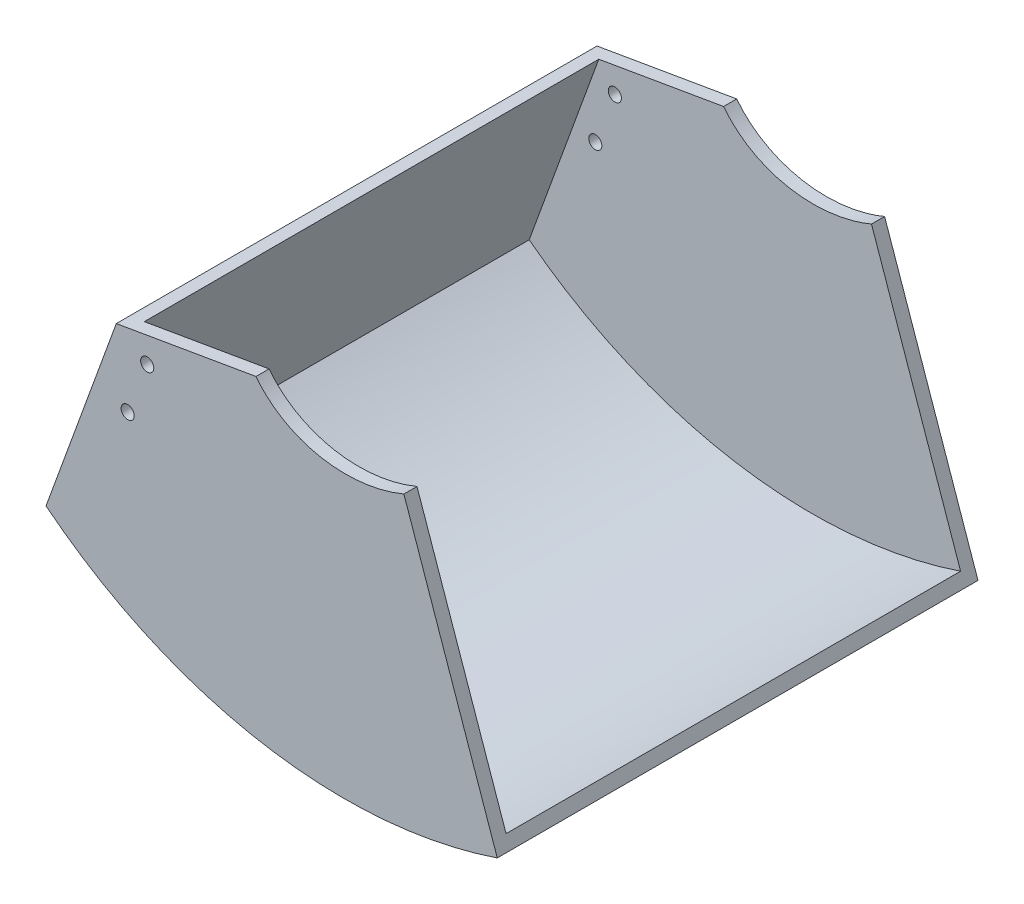
ISO-10303-21;
HEADER;
FILE_DESCRIPTION(('STEP AP214'),'2;1');
FILE_NAME('part.step','',(''),(''),'','','');
FILE_SCHEMA(('AUTOMOTIVE_DESIGN { 1 0 10303 214 1 1 1 1 }'));
ENDSEC;
DATA;
#1=APPLICATION_CONTEXT('core data for automotive mechanical design processes');
#2=APPLICATION_PROTOCOL_DEFINITION('international standard','automotive_design',2000,#1);
#3=PRODUCT_CONTEXT('',#1,'mechanical');
#4=PRODUCT('Part','Part','',(#3));
#5=PRODUCT_RELATED_PRODUCT_CATEGORY('part','',(#4));
#6=PRODUCT_DEFINITION_FORMATION('','',#4);
#7=PRODUCT_DEFINITION_CONTEXT('part definition',#1,'design');
#8=PRODUCT_DEFINITION('design','',#6,#7);
#9=PRODUCT_DEFINITION_SHAPE('','',#8);
#10=(LENGTH_UNIT() NAMED_UNIT(*) SI_UNIT(.MILLI.,.METRE.));
#11=(NAMED_UNIT(*) PLANE_ANGLE_UNIT() SI_UNIT($,.RADIAN.));
#12=(NAMED_UNIT(*) SI_UNIT($,.STERADIAN.) SOLID_ANGLE_UNIT());
#13=UNCERTAINTY_MEASURE_WITH_UNIT(LENGTH_MEASURE(1.E-05),#10,'distance_accuracy_value','');
#14=(GEOMETRIC_REPRESENTATION_CONTEXT(3) GLOBAL_UNCERTAINTY_ASSIGNED_CONTEXT((#13)) GLOBAL_UNIT_ASSIGNED_CONTEXT((#10,
#11,#12)) REPRESENTATION_CONTEXT('',''));
#15=CARTESIAN_POINT('',(0.,0.,0.));
#16=DIRECTION('',(0.,0.,1.));
#17=DIRECTION('',(1.,0.,0.));
#18=AXIS2_PLACEMENT_3D('',#15,#16,#17);
#19=CARTESIAN_POINT('',(72.3340435630929,64.9068914246385,107.));
#20=DIRECTION('',(0.,0.,1.));
#21=DIRECTION('',(1.,0.,0.));
#22=AXIS2_PLACEMENT_3D('',#19,#20,#21);
#23=PLANE('',#22);
#24=CARTESIAN_POINT('',(18.6882589093407,27.9551341610312,107.));
#25=DIRECTION('',(0.,0.,-1.));
#26=DIRECTION('',(-1.,0.,0.));
#27=AXIS2_PLACEMENT_3D('',#24,#25,#26);
#28=CIRCLE('',#27,1.49999999999999);
#29=CARTESIAN_POINT('',(17.1882589093407,27.9551341610312,107.));
#30=VERTEX_POINT('',#29);
#31=EDGE_CURVE('E264',#30,#30,#28,.T.);
#32=ORIENTED_EDGE('',*,*,#31,.F.);
#33=EDGE_LOOP('',(#32));
#34=FACE_BOUND('',#33,.T.);
#35=CARTESIAN_POINT('',(23.1583286059088,39.6285431279022,107.));
#36=DIRECTION('',(0.,0.,-1.));
#37=DIRECTION('',(-1.,0.,0.));
#38=AXIS2_PLACEMENT_3D('',#35,#36,#37);
#39=CIRCLE('',#38,1.49999999999999);
#40=CARTESIAN_POINT('',(21.6583286059088,39.6285431279022,107.));
#41=VERTEX_POINT('',#40);
#42=EDGE_CURVE('E214',#41,#41,#39,.T.);
#43=ORIENTED_EDGE('',*,*,#42,.F.);
#44=EDGE_LOOP('',(#43));
#45=FACE_BOUND('',#44,.T.);
#46=CARTESIAN_POINT('',(68.2395505972083,85.5518618863192,107.));
#47=DIRECTION('',(0.,0.,1.));
#48=DIRECTION('',(-1.,0.,0.));
#49=AXIS2_PLACEMENT_3D('',#46,#47,#48);
#50=CIRCLE('',#49,106.433803451789);
#51=CARTESIAN_POINT('',(3.56451728503891,1.02201755141087,107.));
#52=VERTEX_POINT('',#51);
#53=CARTESIAN_POINT('',(102.274839972419,-15.2933343024916,107.));
#54=VERTEX_POINT('',#53);
#55=EDGE_CURVE('E137',#52,#54,#50,.T.);
#56=ORIENTED_EDGE('',*,*,#55,.F.);
#57=DIRECTION('',(-0.342020143325663,-0.93969262078591,0.));
#58=VECTOR('',#57,1.);
#59=CARTESIAN_POINT('',(3.56451728503891,1.02201755141087,107.));
#60=LINE('',#59,#58);
#61=CARTESIAN_POINT('',(19.4893686582851,44.7751871075765,107.));
#62=VERTEX_POINT('',#61);
#63=EDGE_CURVE('E63',#62,#52,#60,.T.);
#64=ORIENTED_EDGE('',*,*,#63,.F.);
#65=DIRECTION('',(-0.985528105043327,-0.169512106262974,0.));
#66=VECTOR('',#65,1.);
#67=CARTESIAN_POINT('',(48.0436584883286,49.6865618184188,107.));
#68=LINE('',#67,#66);
#69=CARTESIAN_POINT('',(48.0436584883286,49.6865618184188,107.));
#70=VERTEX_POINT('',#69);
#71=EDGE_CURVE('E169',#70,#62,#68,.T.);
#72=ORIENTED_EDGE('',*,*,#71,.F.);
#73=CARTESIAN_POINT('',(72.3340435630929,64.9068914246385,107.));
#74=DIRECTION('',(0.,0.,-1.));
#75=DIRECTION('',(0.93734212712004,0.348410299397246,0.));
#76=AXIS2_PLACEMENT_3D('',#73,#74,#75);
#77=ELLIPSE('',#76,28.9606322735671,23.6005498865162);
#78=CARTESIAN_POINT('',(81.8904704722115,43.3117280106042,107.));
#79=VERTEX_POINT('',#78);
#80=EDGE_CURVE('E165',#79,#70,#77,.T.);
#81=ORIENTED_EDGE('',*,*,#80,.F.);
#82=DIRECTION('',(-0.328520624941273,0.944496796706159,0.));
#83=VECTOR('',#82,1.);
#84=CARTESIAN_POINT('',(103.260442773601,-18.1269423558897,107.));
#85=LINE('',#84,#83);
#86=EDGE_CURVE('E172',#54,#79,#85,.T.);
#87=ORIENTED_EDGE('',*,*,#86,.F.);
#88=EDGE_LOOP('',(#56,#64,#72,#81,#87));
#89=FACE_BOUND('',#88,.T.);
#90=ADVANCED_FACE('F37',(#34,#45,#89),#23,.F.);
#91=DIRECTION('',(0.,0.,1.));
#92=VECTOR('',#91,1.);
#93=SURFACE_OF_LINEAR_EXTRUSION('',#77,#92);
#94=CARTESIAN_POINT('',(72.3340435630929,64.9068914246385,110.));
#95=DIRECTION('',(0.,0.,-1.));
#96=DIRECTION('',(0.93734212712004,0.348410299397246,0.));
#97=AXIS2_PLACEMENT_3D('',#94,#95,#96);
#98=ELLIPSE('',#97,28.9606322735671,23.6005498865162);
#99=CARTESIAN_POINT('',(81.8904704722115,43.3117280106042,110.));
#100=VERTEX_POINT('',#99);
#101=CARTESIAN_POINT('',(48.0436584883286,49.6865618184188,110.));
#102=VERTEX_POINT('',#101);
#103=EDGE_CURVE('E164',#100,#102,#98,.T.);
#104=ORIENTED_EDGE('',*,*,#103,.F.);
#105=DIRECTION('',(0.,0.,1.));
#106=VECTOR('',#105,1.);
#107=CARTESIAN_POINT('',(81.8904704722115,43.3117280106042,107.));
#108=LINE('',#107,#106);
#109=EDGE_CURVE('E11',#79,#100,#108,.T.);
#110=ORIENTED_EDGE('',*,*,#109,.F.);
#111=ORIENTED_EDGE('',*,*,#80,.T.);
#112=DIRECTION('',(0.,0.,1.));
#113=VECTOR('',#112,1.);
#114=CARTESIAN_POINT('',(48.0436584883286,49.6865618184188,107.));
#115=LINE('',#114,#113);
#116=EDGE_CURVE('E42',#70,#102,#115,.T.);
#117=ORIENTED_EDGE('',*,*,#116,.T.);
#118=EDGE_LOOP('',(#104,#110,#111,#117));
#119=FACE_BOUND('',#118,.T.);
#120=ADVANCED_FACE('F39',(#119),#93,.T.);
#121=CARTESIAN_POINT('',(103.260442773601,-18.1269423558897,107.));
#122=DIRECTION('',(0.944496796706159,0.328520624941273,0.));
#123=DIRECTION('',(-0.328520624941273,0.944496796706159,0.));
#124=AXIS2_PLACEMENT_3D('',#121,#122,#123);
#125=PLANE('',#124);
#126=DIRECTION('',(0.,0.,1.));
#127=VECTOR('',#126,1.);
#128=CARTESIAN_POINT('',(81.8904704722115,43.3117280106041,0.));
#129=LINE('',#128,#127);
#130=CARTESIAN_POINT('',(81.8904704722115,43.3117280106041,0.));
#131=VERTEX_POINT('',#130);
#132=CARTESIAN_POINT('',(81.8904704722115,43.3117280106041,3.00000000000002));
#133=VERTEX_POINT('',#132);
#134=EDGE_CURVE('E118',#131,#133,#129,.T.);
#135=ORIENTED_EDGE('',*,*,#134,.T.);
#136=DIRECTION('',(0.328520624941272,-0.944496796706159,0.));
#137=VECTOR('',#136,1.);
#138=CARTESIAN_POINT('',(103.260442773601,-18.1269423558897,3.00000000000002));
#139=LINE('',#138,#137);
#140=CARTESIAN_POINT('',(102.274839972419,-15.2933343024916,3.00000000000002));
#141=VERTEX_POINT('',#140);
#142=EDGE_CURVE('E145',#133,#141,#139,.T.);
#143=ORIENTED_EDGE('',*,*,#142,.T.);
#144=DIRECTION('',(0.,0.,1.));
#145=VECTOR('',#144,1.);
#146=CARTESIAN_POINT('',(102.274839972419,-15.2933343024916,3.00000000000002));
#147=LINE('',#146,#145);
#148=EDGE_CURVE('E162',#141,#54,#147,.T.);
#149=ORIENTED_EDGE('',*,*,#148,.T.);
#150=ORIENTED_EDGE('',*,*,#86,.T.);
#151=ORIENTED_EDGE('',*,*,#109,.T.);
#152=DIRECTION('',(-0.328520624941273,0.944496796706159,0.));
#153=VECTOR('',#152,1.);
#154=CARTESIAN_POINT('',(103.260442773601,-18.1269423558897,110.));
#155=LINE('',#154,#153);
#156=CARTESIAN_POINT('',(103.260442773601,-18.1269423558897,110.));
#157=VERTEX_POINT('',#156);
#158=EDGE_CURVE('E170',#157,#100,#155,.T.);
#159=ORIENTED_EDGE('',*,*,#158,.F.);
#160=DIRECTION('',(0.,0.,1.));
#161=VECTOR('',#160,1.);
#162=CARTESIAN_POINT('',(103.260442773601,-18.1269423558897,107.));
#163=LINE('',#162,#161);
#164=CARTESIAN_POINT('',(103.260442773601,-18.1269423558897,0.));
#165=VERTEX_POINT('',#164);
#166=EDGE_CURVE('E47',#165,#157,#163,.T.);
#167=ORIENTED_EDGE('',*,*,#166,.F.);
#168=DIRECTION('',(0.328520624941272,-0.944496796706159,0.));
#169=VECTOR('',#168,1.);
#170=CARTESIAN_POINT('',(103.260442773601,-18.1269423558897,0.));
#171=LINE('',#170,#169);
#172=EDGE_CURVE('E148',#131,#165,#171,.T.);
#173=ORIENTED_EDGE('',*,*,#172,.F.);
#174=EDGE_LOOP('',(#135,#143,#149,#150,#151,#159,#167,#173));
#175=FACE_BOUND('',#174,.T.);
#176=ADVANCED_FACE('F202',(#175),#125,.T.);
#177=CARTESIAN_POINT('',(68.2395505972083,85.5518618863192,107.));
#178=DIRECTION('',(0.,0.,1.));
#179=DIRECTION('',(1.,0.,0.));
#180=AXIS2_PLACEMENT_3D('',#177,#178,#179);
#181=CYLINDRICAL_SURFACE('',#180,109.433803451789);
#182=CARTESIAN_POINT('',(68.2395505972083,85.5518618863192,110.));
#183=DIRECTION('',(0.,0.,1.));
#184=DIRECTION('',(1.,0.,0.));
#185=AXIS2_PLACEMENT_3D('',#182,#183,#184);
#186=CIRCLE('',#185,109.433803451789);
#187=CARTESIAN_POINT('',(0.,0.,110.));
#188=VERTEX_POINT('',#187);
#189=EDGE_CURVE('E182',#188,#157,#186,.T.);
#190=ORIENTED_EDGE('',*,*,#189,.F.);
#191=DIRECTION('',(0.,0.,1.));
#192=VECTOR('',#191,1.);
#193=CARTESIAN_POINT('',(0.,0.,107.));
#194=LINE('',#193,#192);
#195=CARTESIAN_POINT('',(0.,0.,0.));
#196=VERTEX_POINT('',#195);
#197=EDGE_CURVE('E188',#196,#188,#194,.T.);
#198=ORIENTED_EDGE('',*,*,#197,.F.);
#199=CARTESIAN_POINT('',(68.2395505972083,85.5518618863192,0.));
#200=DIRECTION('',(0.,0.,-1.));
#201=DIRECTION('',(1.,0.,0.));
#202=AXIS2_PLACEMENT_3D('',#199,#200,#201);
#203=CIRCLE('',#202,109.433803451789);
#204=EDGE_CURVE('E141',#165,#196,#203,.T.);
#205=ORIENTED_EDGE('',*,*,#204,.F.);
#206=ORIENTED_EDGE('',*,*,#166,.T.);
#207=EDGE_LOOP('',(#190,#198,#205,#206));
#208=FACE_BOUND('',#207,.T.);
#209=ADVANCED_FACE('F222',(#208),#181,.T.);
#210=CARTESIAN_POINT('',(16.0836243366193,44.1893946878531,107.));
#211=DIRECTION('',(-0.93969262078591,0.342020143325663,0.));
#212=DIRECTION('',(-0.342020143325663,-0.939692620785911,0.));
#213=AXIS2_PLACEMENT_3D('',#210,#211,#212);
#214=PLANE('',#213);
#215=DIRECTION('',(-0.342020143325663,-0.939692620785911,0.));
#216=VECTOR('',#215,1.);
#217=CARTESIAN_POINT('',(16.0836243366193,44.1893946878531,110.));
#218=LINE('',#217,#216);
#219=CARTESIAN_POINT('',(16.0836243366193,44.1893946878531,110.));
#220=VERTEX_POINT('',#219);
#221=EDGE_CURVE('E179',#220,#188,#218,.T.);
#222=ORIENTED_EDGE('',*,*,#221,.F.);
#223=DIRECTION('',(0.,0.,1.));
#224=VECTOR('',#223,1.);
#225=CARTESIAN_POINT('',(16.0836243366193,44.1893946878531,107.));
#226=LINE('',#225,#224);
#227=CARTESIAN_POINT('',(16.0836243366193,44.1893946878531,0.));
#228=VERTEX_POINT('',#227);
#229=EDGE_CURVE('E189',#228,#220,#226,.T.);
#230=ORIENTED_EDGE('',*,*,#229,.F.);
#231=DIRECTION('',(0.342020143325663,0.939692620785911,0.));
#232=VECTOR('',#231,1.);
#233=CARTESIAN_POINT('',(16.0836243366193,44.1893946878531,0.));
#234=LINE('',#233,#232);
#235=EDGE_CURVE('E136',#196,#228,#234,.T.);
#236=ORIENTED_EDGE('',*,*,#235,.F.);
#237=ORIENTED_EDGE('',*,*,#197,.T.);
#238=EDGE_LOOP('',(#222,#230,#236,#237));
#239=FACE_BOUND('',#238,.T.);
#240=ADVANCED_FACE('F221',(#239),#214,.T.);
#241=CARTESIAN_POINT('',(48.0436584883286,49.6865618184188,107.));
#242=DIRECTION('',(-0.169512106262974,0.985528105043327,0.));
#243=DIRECTION('',(-0.985528105043327,-0.169512106262974,0.));
#244=AXIS2_PLACEMENT_3D('',#241,#242,#243);
#245=PLANE('',#244);
#246=DIRECTION('',(0.,0.,1.));
#247=VECTOR('',#246,1.);
#248=CARTESIAN_POINT('',(48.0436584883286,49.6865618184188,0.));
#249=LINE('',#248,#247);
#250=CARTESIAN_POINT('',(48.0436584883286,49.6865618184188,0.));
#251=VERTEX_POINT('',#250);
#252=CARTESIAN_POINT('',(48.0436584883286,49.6865618184188,3.00000000000002));
#253=VERTEX_POINT('',#252);
#254=EDGE_CURVE('E55',#251,#253,#249,.T.);
#255=ORIENTED_EDGE('',*,*,#254,.F.);
#256=DIRECTION('',(0.985528105043327,0.169512106262974,0.));
#257=VECTOR('',#256,1.);
#258=CARTESIAN_POINT('',(77.8876729684396,54.8197708339485,0.));
#259=LINE('',#258,#257);
#260=EDGE_CURVE('E128',#228,#251,#259,.T.);
#261=ORIENTED_EDGE('',*,*,#260,.F.);
#262=ORIENTED_EDGE('',*,*,#229,.T.);
#263=DIRECTION('',(-0.985528105043327,-0.169512106262974,0.));
#264=VECTOR('',#263,1.);
#265=CARTESIAN_POINT('',(48.0436584883286,49.6865618184188,110.));
#266=LINE('',#265,#264);
#267=EDGE_CURVE('E176',#102,#220,#266,.T.);
#268=ORIENTED_EDGE('',*,*,#267,.F.);
#269=ORIENTED_EDGE('',*,*,#116,.F.);
#270=ORIENTED_EDGE('',*,*,#71,.T.);
#271=DIRECTION('',(0.,0.,1.));
#272=VECTOR('',#271,1.);
#273=CARTESIAN_POINT('',(19.4893686582851,44.7751871075765,3.00000000000002));
#274=LINE('',#273,#272);
#275=CARTESIAN_POINT('',(19.4893686582851,44.7751871075765,3.00000000000002));
#276=VERTEX_POINT('',#275);
#277=EDGE_CURVE('E159',#276,#62,#274,.T.);
#278=ORIENTED_EDGE('',*,*,#277,.F.);
#279=DIRECTION('',(0.985528105043327,0.169512106262974,0.));
#280=VECTOR('',#279,1.);
#281=CARTESIAN_POINT('',(77.8876729684396,54.8197708339485,3.00000000000002));
#282=LINE('',#281,#280);
#283=EDGE_CURVE('E130',#276,#253,#282,.T.);
#284=ORIENTED_EDGE('',*,*,#283,.T.);
#285=EDGE_LOOP('',(#255,#261,#262,#268,#269,#270,#278,#284));
#286=FACE_BOUND('',#285,.T.);
#287=ADVANCED_FACE('F127',(#286),#245,.T.);
#288=CARTESIAN_POINT('',(72.3340435630929,64.9068914246385,110.));
#289=DIRECTION('',(0.,0.,1.));
#290=DIRECTION('',(1.,0.,0.));
#291=AXIS2_PLACEMENT_3D('',#288,#289,#290);
#292=PLANE('',#291);
#293=CARTESIAN_POINT('',(18.6882589093407,27.9551341610312,110.));
#294=DIRECTION('',(0.,0.,-1.));
#295=DIRECTION('',(-1.,0.,0.));
#296=AXIS2_PLACEMENT_3D('',#293,#294,#295);
#297=CIRCLE('',#296,1.49999999999999);
#298=CARTESIAN_POINT('',(17.1882589093407,27.9551341610312,110.));
#299=VERTEX_POINT('',#298);
#300=EDGE_CURVE('E253',#299,#299,#297,.T.);
#301=ORIENTED_EDGE('',*,*,#300,.T.);
#302=EDGE_LOOP('',(#301));
#303=FACE_BOUND('',#302,.T.);
#304=CARTESIAN_POINT('',(23.1583286059088,39.6285431279022,110.));
#305=DIRECTION('',(0.,0.,-1.));
#306=DIRECTION('',(-1.,0.,0.));
#307=AXIS2_PLACEMENT_3D('',#304,#305,#306);
#308=CIRCLE('',#307,1.49999999999999);
#309=CARTESIAN_POINT('',(21.6583286059088,39.6285431279022,110.));
#310=VERTEX_POINT('',#309);
#311=EDGE_CURVE('E211',#310,#310,#308,.T.);
#312=ORIENTED_EDGE('',*,*,#311,.T.);
#313=EDGE_LOOP('',(#312));
#314=FACE_BOUND('',#313,.T.);
#315=ORIENTED_EDGE('',*,*,#103,.T.);
#316=ORIENTED_EDGE('',*,*,#267,.T.);
#317=ORIENTED_EDGE('',*,*,#221,.T.);
#318=ORIENTED_EDGE('',*,*,#189,.T.);
#319=ORIENTED_EDGE('',*,*,#158,.T.);
#320=EDGE_LOOP('',(#315,#316,#317,#318,#319));
#321=FACE_BOUND('',#320,.T.);
#322=ADVANCED_FACE('F197',(#303,#314,#321),#292,.T.);
#323=CARTESIAN_POINT('',(68.2395505972083,85.5518618863192,3.00000000000002));
#324=DIRECTION('',(0.,0.,1.));
#325=DIRECTION('',(1.,0.,0.));
#326=AXIS2_PLACEMENT_3D('',#323,#324,#325);
#327=CYLINDRICAL_SURFACE('',#326,106.433803451789);
#328=ORIENTED_EDGE('',*,*,#55,.T.);
#329=ORIENTED_EDGE('',*,*,#148,.F.);
#330=CARTESIAN_POINT('',(68.2395505972083,85.5518618863192,3.00000000000002));
#331=DIRECTION('',(0.,0.,1.));
#332=DIRECTION('',(-1.,0.,0.));
#333=AXIS2_PLACEMENT_3D('',#330,#331,#332);
#334=CIRCLE('',#333,106.433803451789);
#335=CARTESIAN_POINT('',(3.56451728503891,1.02201755141087,3.00000000000002));
#336=VERTEX_POINT('',#335);
#337=EDGE_CURVE('E149',#336,#141,#334,.T.);
#338=ORIENTED_EDGE('',*,*,#337,.F.);
#339=DIRECTION('',(0.,0.,1.));
#340=VECTOR('',#339,1.);
#341=CARTESIAN_POINT('',(3.56451728503891,1.02201755141087,3.00000000000002));
#342=LINE('',#341,#340);
#343=EDGE_CURVE('E154',#336,#52,#342,.T.);
#344=ORIENTED_EDGE('',*,*,#343,.T.);
#345=EDGE_LOOP('',(#328,#329,#338,#344));
#346=FACE_BOUND('',#345,.T.);
#347=ADVANCED_FACE('F241',(#346),#327,.F.);
#348=CARTESIAN_POINT('',(3.56451728503891,1.02201755141087,3.00000000000002));
#349=DIRECTION('',(-0.939692620785911,0.342020143325663,0.));
#350=DIRECTION('',(-0.342020143325663,-0.939692620785911,0.));
#351=AXIS2_PLACEMENT_3D('',#348,#349,#350);
#352=PLANE('',#351);
#353=ORIENTED_EDGE('',*,*,#63,.T.);
#354=ORIENTED_EDGE('',*,*,#343,.F.);
#355=DIRECTION('',(-0.342020143325663,-0.93969262078591,0.));
#356=VECTOR('',#355,1.);
#357=CARTESIAN_POINT('',(3.56451728503891,1.02201755141087,3.00000000000002));
#358=LINE('',#357,#356);
#359=EDGE_CURVE('E152',#276,#336,#358,.T.);
#360=ORIENTED_EDGE('',*,*,#359,.F.);
#361=ORIENTED_EDGE('',*,*,#277,.T.);
#362=EDGE_LOOP('',(#353,#354,#360,#361));
#363=FACE_BOUND('',#362,.T.);
#364=ADVANCED_FACE('F206',(#363),#352,.F.);
#365=CARTESIAN_POINT('',(68.2395505972083,85.5518618863192,0.));
#366=DIRECTION('',(0.,0.,1.));
#367=DIRECTION('',(1.,0.,0.));
#368=AXIS2_PLACEMENT_3D('',#365,#366,#367);
#369=PLANE('',#368);
#370=CARTESIAN_POINT('',(18.6882589093407,27.9551341610312,0.));
#371=DIRECTION('',(0.,0.,-1.));
#372=DIRECTION('',(-1.,0.,0.));
#373=AXIS2_PLACEMENT_3D('',#370,#371,#372);
#374=CIRCLE('',#373,1.49999999999999);
#375=CARTESIAN_POINT('',(17.1882589093407,27.9551341610312,0.));
#376=VERTEX_POINT('',#375);
#377=EDGE_CURVE('E278',#376,#376,#374,.T.);
#378=ORIENTED_EDGE('',*,*,#377,.F.);
#379=EDGE_LOOP('',(#378));
#380=FACE_BOUND('',#379,.T.);
#381=CARTESIAN_POINT('',(23.1583286059088,39.6285431279022,0.));
#382=DIRECTION('',(0.,0.,-1.));
#383=DIRECTION('',(-1.,0.,0.));
#384=AXIS2_PLACEMENT_3D('',#381,#382,#383);
#385=CIRCLE('',#384,1.49999999999999);
#386=CARTESIAN_POINT('',(21.6583286059088,39.6285431279022,0.));
#387=VERTEX_POINT('',#386);
#388=EDGE_CURVE('E272',#387,#387,#385,.T.);
#389=ORIENTED_EDGE('',*,*,#388,.F.);
#390=EDGE_LOOP('',(#389));
#391=FACE_BOUND('',#390,.T.);
#392=ORIENTED_EDGE('',*,*,#260,.T.);
#393=CARTESIAN_POINT('',(72.3363621609606,64.9152150359323,0.));
#394=DIRECTION('',(0.,0.,1.));
#395=DIRECTION('',(0.937200674379727,0.348790619057029,0.));
#396=AXIS2_PLACEMENT_3D('',#393,#394,#395);
#397=ELLIPSE('',#396,28.9663335364191,23.6075307531346);
#398=EDGE_CURVE('E115',#251,#131,#397,.T.);
#399=ORIENTED_EDGE('',*,*,#398,.T.);
#400=ORIENTED_EDGE('',*,*,#172,.T.);
#401=ORIENTED_EDGE('',*,*,#204,.T.);
#402=ORIENTED_EDGE('',*,*,#235,.T.);
#403=EDGE_LOOP('',(#392,#399,#400,#401,#402));
#404=FACE_BOUND('',#403,.T.);
#405=ADVANCED_FACE('F133',(#380,#391,#404),#369,.F.);
#406=CARTESIAN_POINT('',(68.2395505972083,85.5518618863192,3.00000000000002));
#407=DIRECTION('',(0.,0.,1.));
#408=DIRECTION('',(1.,0.,0.));
#409=AXIS2_PLACEMENT_3D('',#406,#407,#408);
#410=PLANE('',#409);
#411=CARTESIAN_POINT('',(18.6882589093407,27.9551341610312,3.00000000000002));
#412=DIRECTION('',(0.,0.,1.));
#413=DIRECTION('',(1.,0.,0.));
#414=AXIS2_PLACEMENT_3D('',#411,#412,#413);
#415=CIRCLE('',#414,1.49999999999998);
#416=CARTESIAN_POINT('',(20.1882589093407,27.9551341610312,3.00000000000002));
#417=VERTEX_POINT('',#416);
#418=EDGE_CURVE('E275',#417,#417,#415,.T.);
#419=ORIENTED_EDGE('',*,*,#418,.F.);
#420=EDGE_LOOP('',(#419));
#421=FACE_BOUND('',#420,.T.);
#422=CARTESIAN_POINT('',(23.1583286059088,39.6285431279022,3.00000000000002));
#423=DIRECTION('',(0.,0.,1.));
#424=DIRECTION('',(1.,0.,0.));
#425=AXIS2_PLACEMENT_3D('',#422,#423,#424);
#426=CIRCLE('',#425,1.49999999999998);
#427=CARTESIAN_POINT('',(24.6583286059087,39.6285431279022,3.00000000000002));
#428=VERTEX_POINT('',#427);
#429=EDGE_CURVE('E269',#428,#428,#426,.T.);
#430=ORIENTED_EDGE('',*,*,#429,.F.);
#431=EDGE_LOOP('',(#430));
#432=FACE_BOUND('',#431,.T.);
#433=CARTESIAN_POINT('',(72.3363621609606,64.9152150359323,3.00000000000002));
#434=DIRECTION('',(0.,0.,1.));
#435=DIRECTION('',(0.937200674379727,0.348790619057029,0.));
#436=AXIS2_PLACEMENT_3D('',#433,#434,#435);
#437=ELLIPSE('',#436,28.9663335364191,23.6075307531346);
#438=EDGE_CURVE('E122',#253,#133,#437,.T.);
#439=ORIENTED_EDGE('',*,*,#438,.F.);
#440=ORIENTED_EDGE('',*,*,#283,.F.);
#441=ORIENTED_EDGE('',*,*,#359,.T.);
#442=ORIENTED_EDGE('',*,*,#337,.T.);
#443=ORIENTED_EDGE('',*,*,#142,.F.);
#444=EDGE_LOOP('',(#439,#440,#441,#442,#443));
#445=FACE_BOUND('',#444,.T.);
#446=ADVANCED_FACE('F209',(#421,#432,#445),#410,.T.);
#447=DIRECTION('',(0.,0.,1.));
#448=VECTOR('',#447,1.);
#449=SURFACE_OF_LINEAR_EXTRUSION('',#397,#448);
#450=ORIENTED_EDGE('',*,*,#438,.T.);
#451=ORIENTED_EDGE('',*,*,#134,.F.);
#452=ORIENTED_EDGE('',*,*,#398,.F.);
#453=ORIENTED_EDGE('',*,*,#254,.T.);
#454=EDGE_LOOP('',(#450,#451,#452,#453));
#455=FACE_BOUND('',#454,.T.);
#456=ADVANCED_FACE('F116',(#455),#449,.F.);
#457=CARTESIAN_POINT('',(23.1583286059088,39.6285431279022,107.));
#458=DIRECTION('',(0.,0.,-1.));
#459=DIRECTION('',(-1.,0.,0.));
#460=AXIS2_PLACEMENT_3D('',#457,#458,#459);
#461=CYLINDRICAL_SURFACE('',#460,1.49999999999999);
#462=ORIENTED_EDGE('',*,*,#311,.F.);
#463=EDGE_LOOP('',(#462));
#464=FACE_BOUND('',#463,.T.);
#465=ORIENTED_EDGE('',*,*,#42,.T.);
#466=EDGE_LOOP('',(#465));
#467=FACE_BOUND('',#466,.T.);
#468=ADVANCED_FACE('F256',(#464,#467),#461,.F.);
#469=CARTESIAN_POINT('',(18.6882589093407,27.9551341610312,107.));
#470=DIRECTION('',(0.,0.,-1.));
#471=DIRECTION('',(-1.,0.,0.));
#472=AXIS2_PLACEMENT_3D('',#469,#470,#471);
#473=CYLINDRICAL_SURFACE('',#472,1.49999999999999);
#474=ORIENTED_EDGE('',*,*,#300,.F.);
#475=EDGE_LOOP('',(#474));
#476=FACE_BOUND('',#475,.T.);
#477=ORIENTED_EDGE('',*,*,#31,.T.);
#478=EDGE_LOOP('',(#477));
#479=FACE_BOUND('',#478,.T.);
#480=ADVANCED_FACE('F259',(#476,#479),#473,.F.);
#481=CARTESIAN_POINT('',(23.1583286059088,39.6285431279022,0.));
#482=DIRECTION('',(0.,0.,-1.));
#483=DIRECTION('',(-1.,0.,0.));
#484=AXIS2_PLACEMENT_3D('',#481,#482,#483);
#485=CYLINDRICAL_SURFACE('',#484,1.49999999999998);
#486=ORIENTED_EDGE('',*,*,#429,.T.);
#487=EDGE_LOOP('',(#486));
#488=FACE_BOUND('',#487,.T.);
#489=ORIENTED_EDGE('',*,*,#388,.T.);
#490=EDGE_LOOP('',(#489));
#491=FACE_BOUND('',#490,.T.);
#492=ADVANCED_FACE('F289',(#488,#491),#485,.F.);
#493=CARTESIAN_POINT('',(18.6882589093407,27.9551341610312,0.));
#494=DIRECTION('',(0.,0.,-1.));
#495=DIRECTION('',(-1.,0.,0.));
#496=AXIS2_PLACEMENT_3D('',#493,#494,#495);
#497=CYLINDRICAL_SURFACE('',#496,1.49999999999998);
#498=ORIENTED_EDGE('',*,*,#418,.T.);
#499=EDGE_LOOP('',(#498));
#500=FACE_BOUND('',#499,.T.);
#501=ORIENTED_EDGE('',*,*,#377,.T.);
#502=EDGE_LOOP('',(#501));
#503=FACE_BOUND('',#502,.T.);
#504=ADVANCED_FACE('F282',(#500,#503),#497,.F.);
#505=CLOSED_SHELL('',(#90,#120,#176,#209,#240,#287,#322,#347,#364,#405,#446,#456,#468,#480,#492,#504));
#506=MANIFOLD_SOLID_BREP('B2',#505);
#507=ADVANCED_BREP_SHAPE_REPRESENTATION('',(#18,#506),#14);
#508=SHAPE_DEFINITION_REPRESENTATION(#9,#507);
ENDSEC;
END-ISO-10303-21;
